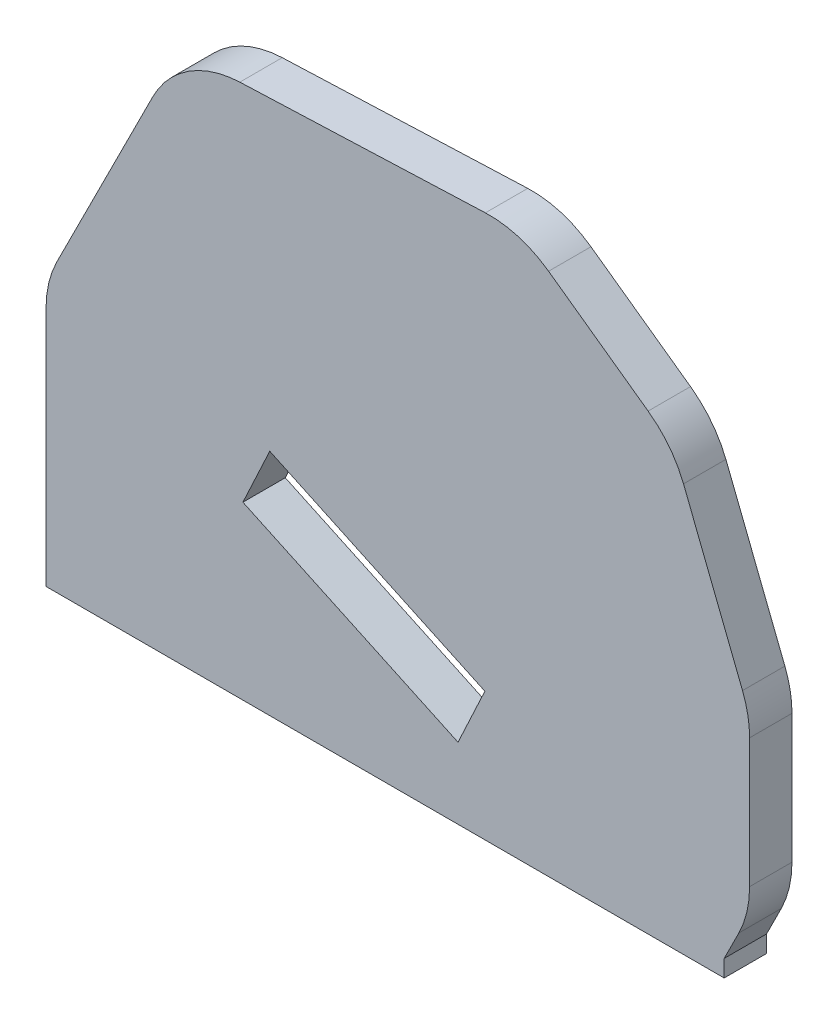
ISO-10303-21;
HEADER;
FILE_DESCRIPTION(('STEP AP214'),'2;1');
FILE_NAME('part.step','',(''),(''),'','','');
FILE_SCHEMA(('AUTOMOTIVE_DESIGN { 1 0 10303 214 1 1 1 1 }'));
ENDSEC;
DATA;
#1=APPLICATION_CONTEXT('core data for automotive mechanical design processes');
#2=APPLICATION_PROTOCOL_DEFINITION('international standard','automotive_design',2000,#1);
#3=PRODUCT_CONTEXT('',#1,'mechanical');
#4=PRODUCT('Part','Part','',(#3));
#5=PRODUCT_RELATED_PRODUCT_CATEGORY('part','',(#4));
#6=PRODUCT_DEFINITION_FORMATION('','',#4);
#7=PRODUCT_DEFINITION_CONTEXT('part definition',#1,'design');
#8=PRODUCT_DEFINITION('design','',#6,#7);
#9=PRODUCT_DEFINITION_SHAPE('','',#8);
#10=(LENGTH_UNIT() NAMED_UNIT(*) SI_UNIT(.MILLI.,.METRE.));
#11=(NAMED_UNIT(*) PLANE_ANGLE_UNIT() SI_UNIT($,.RADIAN.));
#12=(NAMED_UNIT(*) SI_UNIT($,.STERADIAN.) SOLID_ANGLE_UNIT());
#13=UNCERTAINTY_MEASURE_WITH_UNIT(LENGTH_MEASURE(1.E-05),#10,'distance_accuracy_value','');
#14=(GEOMETRIC_REPRESENTATION_CONTEXT(3) GLOBAL_UNCERTAINTY_ASSIGNED_CONTEXT((#13)) GLOBAL_UNIT_ASSIGNED_CONTEXT((#10,
#11,#12)) REPRESENTATION_CONTEXT('',''));
#15=CARTESIAN_POINT('',(0.,0.,0.));
#16=DIRECTION('',(0.,0.,1.));
#17=DIRECTION('',(1.,0.,0.));
#18=AXIS2_PLACEMENT_3D('',#15,#16,#17);
#19=CARTESIAN_POINT('',(0.,0.,0.125));
#20=DIRECTION('',(0.,0.,1.));
#21=DIRECTION('',(1.,0.,0.));
#22=AXIS2_PLACEMENT_3D('',#19,#20,#21);
#23=PLANE('',#22);
#24=DIRECTION('',(0.447213595499958,0.894427190999916,0.));
#25=VECTOR('',#24,1.);
#26=CARTESIAN_POINT('',(4.,0.1,0.125));
#27=LINE('',#26,#25);
#28=CARTESIAN_POINT('',(4.,0.1,0.125));
#29=VERTEX_POINT('',#28);
#30=CARTESIAN_POINT('',(4.08665631459995,0.273312629199899,0.125));
#31=VERTEX_POINT('',#30);
#32=EDGE_CURVE('E274',#29,#31,#27,.T.);
#33=ORIENTED_EDGE('',*,*,#32,.T.);
#34=CARTESIAN_POINT('',(3.55,0.541640786499874,0.125));
#35=DIRECTION('',(0.,0.,1.));
#36=DIRECTION('',(1.,0.,0.));
#37=AXIS2_PLACEMENT_3D('',#34,#35,#36);
#38=CIRCLE('',#37,0.6);
#39=CARTESIAN_POINT('',(4.15,0.541640786499874,0.125));
#40=VERTEX_POINT('',#39);
#41=EDGE_CURVE('E380',#31,#40,#38,.T.);
#42=ORIENTED_EDGE('',*,*,#41,.T.);
#43=DIRECTION('',(0.,1.,0.));
#44=VECTOR('',#43,1.);
#45=CARTESIAN_POINT('',(4.15,0.4,0.125));
#46=LINE('',#45,#44);
#47=CARTESIAN_POINT('',(4.15,1.30201288561444,0.125));
#48=VERTEX_POINT('',#47);
#49=EDGE_CURVE('E278',#40,#48,#46,.T.);
#50=ORIENTED_EDGE('',*,*,#49,.T.);
#51=CARTESIAN_POINT('',(3.55,1.30201288561444,0.125));
#52=DIRECTION('',(0.,0.,1.));
#53=DIRECTION('',(1.,0.,0.));
#54=AXIS2_PLACEMENT_3D('',#51,#52,#53);
#55=CIRCLE('',#54,0.6);
#56=CARTESIAN_POINT('',(4.10813037386705,1.52221843905718,0.125));
#57=VERTEX_POINT('',#56);
#58=EDGE_CURVE('E377',#48,#57,#55,.T.);
#59=ORIENTED_EDGE('',*,*,#58,.T.);
#60=DIRECTION('',(-0.367009255737904,0.930217289778421,0.));
#61=VECTOR('',#60,1.);
#62=CARTESIAN_POINT('',(4.15,1.4160961831835,0.125));
#63=LINE('',#62,#61);
#64=CARTESIAN_POINT('',(3.76013876774564,2.40423382055228,0.125));
#65=VERTEX_POINT('',#64);
#66=EDGE_CURVE('E282',#57,#65,#63,.T.);
#67=ORIENTED_EDGE('',*,*,#66,.T.);
#68=CARTESIAN_POINT('',(3.20200839387859,2.18402826710954,0.125));
#69=DIRECTION('',(0.,0.,1.));
#70=DIRECTION('',(1.,0.,0.));
#71=AXIS2_PLACEMENT_3D('',#68,#69,#70);
#72=CIRCLE('',#71,0.6);
#73=CARTESIAN_POINT('',(3.55147569512048,2.67175011956513,0.125));
#74=VERTEX_POINT('',#73);
#75=EDGE_CURVE('E374',#65,#74,#72,.T.);
#76=ORIENTED_EDGE('',*,*,#75,.T.);
#77=DIRECTION('',(-0.812869754092644,0.582445502069821,0.));
#78=VECTOR('',#77,1.);
#79=CARTESIAN_POINT('',(3.69523272369698,2.5687439069908,0.125));
#80=LINE('',#79,#78);
#81=CARTESIAN_POINT('',(2.96433257743022,3.09245573230092,0.125));
#82=VERTEX_POINT('',#81);
#83=EDGE_CURVE('E286',#74,#82,#80,.T.);
#84=ORIENTED_EDGE('',*,*,#83,.T.);
#85=CARTESIAN_POINT('',(2.61486527618833,2.60473387984534,0.125));
#86=DIRECTION('',(0.,0.,1.));
#87=DIRECTION('',(1.,0.,0.));
#88=AXIS2_PLACEMENT_3D('',#85,#86,#87);
#89=CIRCLE('',#88,0.6);
#90=CARTESIAN_POINT('',(2.59147813086542,3.20427790778127,0.125));
#91=VERTEX_POINT('',#90);
#92=EDGE_CURVE('E371',#82,#91,#89,.T.);
#93=ORIENTED_EDGE('',*,*,#92,.T.);
#94=DIRECTION('',(-0.999240046559891,-0.0389785755381909,0.));
#95=VECTOR('',#94,1.);
#96=CARTESIAN_POINT('',(2.79707885903946,3.2122980262117,0.125));
#97=LINE('',#96,#95);
#98=CARTESIAN_POINT('',(1.14319745318079,3.14778305652908,0.125));
#99=VERTEX_POINT('',#98);
#100=EDGE_CURVE('E290',#91,#99,#97,.T.);
#101=ORIENTED_EDGE('',*,*,#100,.T.);
#102=CARTESIAN_POINT('',(1.16658459850371,2.54823902859315,0.125));
#103=DIRECTION('',(0.,0.,1.));
#104=DIRECTION('',(1.,0.,0.));
#105=AXIS2_PLACEMENT_3D('',#102,#103,#104);
#106=CIRCLE('',#105,0.6);
#107=CARTESIAN_POINT('',(0.630452139512454,2.81761235024173,0.125));
#108=VERTEX_POINT('',#107);
#109=EDGE_CURVE('E72',#99,#108,#106,.T.);
#110=ORIENTED_EDGE('',*,*,#109,.T.);
#111=DIRECTION('',(-0.448955536080968,-0.893554098318759,0.));
#112=VECTOR('',#111,1.);
#113=CARTESIAN_POINT('',(0.789408464148655,3.13398237782225,0.125));
#114=LINE('',#113,#112);
#115=CARTESIAN_POINT('',(0.0638675410087443,1.68994168054322,0.125));
#116=VERTEX_POINT('',#115);
#117=EDGE_CURVE('E293',#108,#116,#114,.T.);
#118=ORIENTED_EDGE('',*,*,#117,.T.);
#119=CARTESIAN_POINT('',(0.6,1.42056835889464,0.125));
#120=DIRECTION('',(0.,0.,1.));
#121=DIRECTION('',(1.,0.,0.));
#122=AXIS2_PLACEMENT_3D('',#119,#120,#121);
#123=CIRCLE('',#122,0.6);
#124=CARTESIAN_POINT('',(0.,1.42056835889464,0.125));
#125=VERTEX_POINT('',#124);
#126=EDGE_CURVE('E366',#116,#125,#123,.T.);
#127=ORIENTED_EDGE('',*,*,#126,.T.);
#128=DIRECTION('',(0.,-1.,0.));
#129=VECTOR('',#128,1.);
#130=CARTESIAN_POINT('',(0.,1.56282641314709,0.125));
#131=LINE('',#130,#129);
#132=CARTESIAN_POINT('',(0.,0.,0.125));
#133=VERTEX_POINT('',#132);
#134=EDGE_CURVE('E264',#125,#133,#131,.T.);
#135=ORIENTED_EDGE('',*,*,#134,.T.);
#136=DIRECTION('',(1.,0.,0.));
#137=VECTOR('',#136,1.);
#138=CARTESIAN_POINT('',(0.,0.,0.125));
#139=LINE('',#138,#137);
#140=CARTESIAN_POINT('',(4.,0.,0.125));
#141=VERTEX_POINT('',#140);
#142=EDGE_CURVE('E267',#133,#141,#139,.T.);
#143=ORIENTED_EDGE('',*,*,#142,.T.);
#144=DIRECTION('',(0.,1.,0.));
#145=VECTOR('',#144,1.);
#146=CARTESIAN_POINT('',(4.,0.,0.125));
#147=LINE('',#146,#145);
#148=EDGE_CURVE('E271',#141,#29,#147,.T.);
#149=ORIENTED_EDGE('',*,*,#148,.T.);
#150=EDGE_LOOP('',(#33,#42,#50,#59,#67,#76,#84,#93,#101,#110,#118,#127,#135,#143,#149));
#151=FACE_BOUND('',#150,.T.);
#152=DIRECTION('',(0.90630778703665,-0.4226182617407,0.));
#153=VECTOR('',#152,1.);
#154=CARTESIAN_POINT('',(1.16129843717303,1.01098960271376,0.125));
#155=LINE('',#154,#153);
#156=CARTESIAN_POINT('',(1.16129843717303,1.01098960271376,0.125));
#157=VERTEX_POINT('',#156);
#158=CARTESIAN_POINT('',(2.43012933902434,0.419324036276782,0.125));
#159=VERTEX_POINT('',#158);
#160=EDGE_CURVE('E222',#157,#159,#155,.T.);
#161=ORIENTED_EDGE('',*,*,#160,.F.);
#162=DIRECTION('',(-0.4226182617407,-0.90630778703665,0.));
#163=VECTOR('',#162,1.);
#164=CARTESIAN_POINT('',(1.16129843717303,1.01098960271376,0.125));
#165=LINE('',#164,#163);
#166=CARTESIAN_POINT('',(1.31978028532579,1.3508550228525,0.125));
#167=VERTEX_POINT('',#166);
#168=EDGE_CURVE('E211',#167,#157,#165,.T.);
#169=ORIENTED_EDGE('',*,*,#168,.F.);
#170=DIRECTION('',(-0.90630778703665,0.4226182617407,0.));
#171=VECTOR('',#170,1.);
#172=CARTESIAN_POINT('',(1.31978028532579,1.3508550228525,0.125));
#173=LINE('',#172,#171);
#174=CARTESIAN_POINT('',(2.5886111871771,0.759189456415525,0.125));
#175=VERTEX_POINT('',#174);
#176=EDGE_CURVE('E240',#175,#167,#173,.T.);
#177=ORIENTED_EDGE('',*,*,#176,.F.);
#178=DIRECTION('',(0.4226182617407,0.90630778703665,0.));
#179=VECTOR('',#178,1.);
#180=CARTESIAN_POINT('',(2.43012933902434,0.419324036276782,0.125));
#181=LINE('',#180,#179);
#182=EDGE_CURVE('E236',#159,#175,#181,.T.);
#183=ORIENTED_EDGE('',*,*,#182,.F.);
#184=EDGE_LOOP('',(#161,#169,#177,#183));
#185=FACE_BOUND('',#184,.T.);
#186=ADVANCED_FACE('F45',(#151,#185),#23,.T.);
#187=CARTESIAN_POINT('',(0.,0.,-0.125));
#188=DIRECTION('',(0.,0.,1.));
#189=DIRECTION('',(1.,0.,0.));
#190=AXIS2_PLACEMENT_3D('',#187,#188,#189);
#191=PLANE('',#190);
#192=DIRECTION('',(0.,1.,0.));
#193=VECTOR('',#192,1.);
#194=CARTESIAN_POINT('',(4.15,0.4,-0.125));
#195=LINE('',#194,#193);
#196=CARTESIAN_POINT('',(4.15,0.541640786499874,-0.125));
#197=VERTEX_POINT('',#196);
#198=CARTESIAN_POINT('',(4.15,1.30201288561444,-0.125));
#199=VERTEX_POINT('',#198);
#200=EDGE_CURVE('E309',#197,#199,#195,.T.);
#201=ORIENTED_EDGE('',*,*,#200,.F.);
#202=CARTESIAN_POINT('',(3.55,0.541640786499874,-0.125));
#203=DIRECTION('',(0.,0.,1.));
#204=DIRECTION('',(1.,0.,0.));
#205=AXIS2_PLACEMENT_3D('',#202,#203,#204);
#206=CIRCLE('',#205,0.6);
#207=CARTESIAN_POINT('',(4.08665631459995,0.273312629199899,-0.125));
#208=VERTEX_POINT('',#207);
#209=EDGE_CURVE('E360',#197,#208,#206,.F.);
#210=ORIENTED_EDGE('',*,*,#209,.T.);
#211=DIRECTION('',(0.447213595499958,0.894427190999916,0.));
#212=VECTOR('',#211,1.);
#213=CARTESIAN_POINT('',(4.,0.1,-0.125));
#214=LINE('',#213,#212);
#215=CARTESIAN_POINT('',(4.,0.1,-0.125));
#216=VERTEX_POINT('',#215);
#217=EDGE_CURVE('E305',#216,#208,#214,.T.);
#218=ORIENTED_EDGE('',*,*,#217,.F.);
#219=DIRECTION('',(0.,1.,0.));
#220=VECTOR('',#219,1.);
#221=CARTESIAN_POINT('',(4.,0.,-0.125));
#222=LINE('',#221,#220);
#223=CARTESIAN_POINT('',(4.,0.,-0.125));
#224=VERTEX_POINT('',#223);
#225=EDGE_CURVE('E302',#224,#216,#222,.T.);
#226=ORIENTED_EDGE('',*,*,#225,.F.);
#227=DIRECTION('',(1.,0.,0.));
#228=VECTOR('',#227,1.);
#229=CARTESIAN_POINT('',(0.,0.,-0.125));
#230=LINE('',#229,#228);
#231=CARTESIAN_POINT('',(0.,0.,-0.125));
#232=VERTEX_POINT('',#231);
#233=EDGE_CURVE('E299',#232,#224,#230,.T.);
#234=ORIENTED_EDGE('',*,*,#233,.F.);
#235=DIRECTION('',(0.,-1.,0.));
#236=VECTOR('',#235,1.);
#237=CARTESIAN_POINT('',(0.,1.56282641314709,-0.125));
#238=LINE('',#237,#236);
#239=CARTESIAN_POINT('',(0.,1.42056835889464,-0.125));
#240=VERTEX_POINT('',#239);
#241=EDGE_CURVE('E231',#240,#232,#238,.T.);
#242=ORIENTED_EDGE('',*,*,#241,.F.);
#243=CARTESIAN_POINT('',(0.6,1.42056835889464,-0.125));
#244=DIRECTION('',(0.,0.,1.));
#245=DIRECTION('',(1.,0.,0.));
#246=AXIS2_PLACEMENT_3D('',#243,#244,#245);
#247=CIRCLE('',#246,0.6);
#248=CARTESIAN_POINT('',(0.0638675410087443,1.68994168054322,-0.125));
#249=VERTEX_POINT('',#248);
#250=EDGE_CURVE('E345',#240,#249,#247,.F.);
#251=ORIENTED_EDGE('',*,*,#250,.T.);
#252=DIRECTION('',(-0.448955536080968,-0.893554098318759,0.));
#253=VECTOR('',#252,1.);
#254=CARTESIAN_POINT('',(0.789408464148655,3.13398237782225,-0.125));
#255=LINE('',#254,#253);
#256=CARTESIAN_POINT('',(0.630452139512454,2.81761235024173,-0.125));
#257=VERTEX_POINT('',#256);
#258=EDGE_CURVE('E268',#257,#249,#255,.T.);
#259=ORIENTED_EDGE('',*,*,#258,.F.);
#260=CARTESIAN_POINT('',(1.16658459850371,2.54823902859315,-0.125));
#261=DIRECTION('',(0.,0.,1.));
#262=DIRECTION('',(1.,0.,0.));
#263=AXIS2_PLACEMENT_3D('',#260,#261,#262);
#264=CIRCLE('',#263,0.6);
#265=CARTESIAN_POINT('',(1.14319745318079,3.14778305652908,-0.125));
#266=VERTEX_POINT('',#265);
#267=EDGE_CURVE('E348',#257,#266,#264,.F.);
#268=ORIENTED_EDGE('',*,*,#267,.T.);
#269=DIRECTION('',(-0.999240046559891,-0.0389785755381909,0.));
#270=VECTOR('',#269,1.);
#271=CARTESIAN_POINT('',(2.79707885903946,3.2122980262117,-0.125));
#272=LINE('',#271,#270);
#273=CARTESIAN_POINT('',(2.59147813086542,3.20427790778127,-0.125));
#274=VERTEX_POINT('',#273);
#275=EDGE_CURVE('E321',#274,#266,#272,.T.);
#276=ORIENTED_EDGE('',*,*,#275,.F.);
#277=CARTESIAN_POINT('',(2.61486527618833,2.60473387984534,-0.125));
#278=DIRECTION('',(0.,0.,1.));
#279=DIRECTION('',(1.,0.,0.));
#280=AXIS2_PLACEMENT_3D('',#277,#278,#279);
#281=CIRCLE('',#280,0.6);
#282=CARTESIAN_POINT('',(2.96433257743022,3.09245573230092,-0.125));
#283=VERTEX_POINT('',#282);
#284=EDGE_CURVE('E351',#274,#283,#281,.F.);
#285=ORIENTED_EDGE('',*,*,#284,.T.);
#286=DIRECTION('',(-0.812869754092644,0.582445502069821,0.));
#287=VECTOR('',#286,1.);
#288=CARTESIAN_POINT('',(3.69523272369698,2.5687439069908,-0.125));
#289=LINE('',#288,#287);
#290=CARTESIAN_POINT('',(3.55147569512048,2.67175011956513,-0.125));
#291=VERTEX_POINT('',#290);
#292=EDGE_CURVE('E317',#291,#283,#289,.T.);
#293=ORIENTED_EDGE('',*,*,#292,.F.);
#294=CARTESIAN_POINT('',(3.20200839387859,2.18402826710954,-0.125));
#295=DIRECTION('',(0.,0.,1.));
#296=DIRECTION('',(1.,0.,0.));
#297=AXIS2_PLACEMENT_3D('',#294,#295,#296);
#298=CIRCLE('',#297,0.6);
#299=CARTESIAN_POINT('',(3.76013876774564,2.40423382055228,-0.125));
#300=VERTEX_POINT('',#299);
#301=EDGE_CURVE('E354',#291,#300,#298,.F.);
#302=ORIENTED_EDGE('',*,*,#301,.T.);
#303=DIRECTION('',(-0.367009255737904,0.930217289778421,0.));
#304=VECTOR('',#303,1.);
#305=CARTESIAN_POINT('',(4.15,1.4160961831835,-0.125));
#306=LINE('',#305,#304);
#307=CARTESIAN_POINT('',(4.10813037386705,1.52221843905718,-0.125));
#308=VERTEX_POINT('',#307);
#309=EDGE_CURVE('E313',#308,#300,#306,.T.);
#310=ORIENTED_EDGE('',*,*,#309,.F.);
#311=CARTESIAN_POINT('',(3.55,1.30201288561444,-0.125));
#312=DIRECTION('',(0.,0.,1.));
#313=DIRECTION('',(1.,0.,0.));
#314=AXIS2_PLACEMENT_3D('',#311,#312,#313);
#315=CIRCLE('',#314,0.6);
#316=EDGE_CURVE('E357',#308,#199,#315,.F.);
#317=ORIENTED_EDGE('',*,*,#316,.T.);
#318=EDGE_LOOP('',(#201,#210,#218,#226,#234,#242,#251,#259,#268,#276,#285,#293,#302,#310,#317));
#319=FACE_BOUND('',#318,.T.);
#320=DIRECTION('',(-0.4226182617407,-0.90630778703665,0.));
#321=VECTOR('',#320,1.);
#322=CARTESIAN_POINT('',(1.16129843717303,1.01098960271376,-0.125));
#323=LINE('',#322,#321);
#324=CARTESIAN_POINT('',(1.31978028532579,1.3508550228525,-0.125));
#325=VERTEX_POINT('',#324);
#326=CARTESIAN_POINT('',(1.16129843717303,1.01098960271376,-0.125));
#327=VERTEX_POINT('',#326);
#328=EDGE_CURVE('E245',#325,#327,#323,.T.);
#329=ORIENTED_EDGE('',*,*,#328,.T.);
#330=DIRECTION('',(0.90630778703665,-0.4226182617407,0.));
#331=VECTOR('',#330,1.);
#332=CARTESIAN_POINT('',(1.16129843717303,1.01098960271376,-0.125));
#333=LINE('',#332,#331);
#334=CARTESIAN_POINT('',(2.43012933902434,0.419324036276782,-0.125));
#335=VERTEX_POINT('',#334);
#336=EDGE_CURVE('E229',#327,#335,#333,.T.);
#337=ORIENTED_EDGE('',*,*,#336,.T.);
#338=DIRECTION('',(0.4226182617407,0.90630778703665,0.));
#339=VECTOR('',#338,1.);
#340=CARTESIAN_POINT('',(2.43012933902434,0.419324036276782,-0.125));
#341=LINE('',#340,#339);
#342=CARTESIAN_POINT('',(2.5886111871771,0.759189456415525,-0.125));
#343=VERTEX_POINT('',#342);
#344=EDGE_CURVE('E250',#335,#343,#341,.T.);
#345=ORIENTED_EDGE('',*,*,#344,.T.);
#346=DIRECTION('',(-0.90630778703665,0.4226182617407,0.));
#347=VECTOR('',#346,1.);
#348=CARTESIAN_POINT('',(1.31978028532579,1.3508550228525,-0.125));
#349=LINE('',#348,#347);
#350=EDGE_CURVE('E223',#343,#325,#349,.T.);
#351=ORIENTED_EDGE('',*,*,#350,.T.);
#352=EDGE_LOOP('',(#329,#337,#345,#351));
#353=FACE_BOUND('',#352,.T.);
#354=ADVANCED_FACE('F413',(#319,#353),#191,.F.);
#355=CARTESIAN_POINT('',(0.,1.56282641314709,0.125));
#356=DIRECTION('',(1.,0.,0.));
#357=DIRECTION('',(0.,1.,0.));
#358=AXIS2_PLACEMENT_3D('',#355,#356,#357);
#359=PLANE('',#358);
#360=ORIENTED_EDGE('',*,*,#134,.F.);
#361=DIRECTION('',(0.,0.,-1.));
#362=VECTOR('',#361,1.);
#363=CARTESIAN_POINT('',(0.,1.42056835889464,0.125));
#364=LINE('',#363,#362);
#365=EDGE_CURVE('E11',#125,#240,#364,.T.);
#366=ORIENTED_EDGE('',*,*,#365,.T.);
#367=ORIENTED_EDGE('',*,*,#241,.T.);
#368=DIRECTION('',(0.,0.,-1.));
#369=VECTOR('',#368,1.);
#370=CARTESIAN_POINT('',(0.,0.,0.125));
#371=LINE('',#370,#369);
#372=EDGE_CURVE('E334',#133,#232,#371,.T.);
#373=ORIENTED_EDGE('',*,*,#372,.F.);
#374=EDGE_LOOP('',(#360,#366,#367,#373));
#375=FACE_BOUND('',#374,.T.);
#376=ADVANCED_FACE('F423',(#375),#359,.F.);
#377=CARTESIAN_POINT('',(0.,0.,0.125));
#378=DIRECTION('',(0.,1.,0.));
#379=DIRECTION('',(0.,0.,1.));
#380=AXIS2_PLACEMENT_3D('',#377,#378,#379);
#381=PLANE('',#380);
#382=ORIENTED_EDGE('',*,*,#233,.T.);
#383=DIRECTION('',(0.,0.,-1.));
#384=VECTOR('',#383,1.);
#385=CARTESIAN_POINT('',(4.,0.,0.125));
#386=LINE('',#385,#384);
#387=EDGE_CURVE('E330',#141,#224,#386,.T.);
#388=ORIENTED_EDGE('',*,*,#387,.F.);
#389=ORIENTED_EDGE('',*,*,#142,.F.);
#390=ORIENTED_EDGE('',*,*,#372,.T.);
#391=EDGE_LOOP('',(#382,#388,#389,#390));
#392=FACE_BOUND('',#391,.T.);
#393=ADVANCED_FACE('F428',(#392),#381,.F.);
#394=CARTESIAN_POINT('',(4.,0.,0.125));
#395=DIRECTION('',(-1.,0.,0.));
#396=DIRECTION('',(0.,0.,1.));
#397=AXIS2_PLACEMENT_3D('',#394,#395,#396);
#398=PLANE('',#397);
#399=ORIENTED_EDGE('',*,*,#225,.T.);
#400=DIRECTION('',(0.,0.,-1.));
#401=VECTOR('',#400,1.);
#402=CARTESIAN_POINT('',(4.,0.1,0.125));
#403=LINE('',#402,#401);
#404=EDGE_CURVE('E296',#29,#216,#403,.T.);
#405=ORIENTED_EDGE('',*,*,#404,.F.);
#406=ORIENTED_EDGE('',*,*,#148,.F.);
#407=ORIENTED_EDGE('',*,*,#387,.T.);
#408=EDGE_LOOP('',(#399,#405,#406,#407));
#409=FACE_BOUND('',#408,.T.);
#410=ADVANCED_FACE('F433',(#409),#398,.F.);
#411=CARTESIAN_POINT('',(4.,0.1,0.125));
#412=DIRECTION('',(-0.894427190999916,0.447213595499958,0.));
#413=DIRECTION('',(-0.447213595499958,-0.894427190999916,0.));
#414=AXIS2_PLACEMENT_3D('',#411,#412,#413);
#415=PLANE('',#414);
#416=ORIENTED_EDGE('',*,*,#217,.T.);
#417=DIRECTION('',(0.,0.,-1.));
#418=VECTOR('',#417,1.);
#419=CARTESIAN_POINT('',(4.08665631459995,0.273312629199899,0.125));
#420=LINE('',#419,#418);
#421=EDGE_CURVE('E363',#208,#31,#420,.F.);
#422=ORIENTED_EDGE('',*,*,#421,.T.);
#423=ORIENTED_EDGE('',*,*,#32,.F.);
#424=ORIENTED_EDGE('',*,*,#404,.T.);
#425=EDGE_LOOP('',(#416,#422,#423,#424));
#426=FACE_BOUND('',#425,.T.);
#427=ADVANCED_FACE('F498',(#426),#415,.F.);
#428=CARTESIAN_POINT('',(4.15,0.4,0.125));
#429=DIRECTION('',(-1.,0.,0.));
#430=DIRECTION('',(0.,0.,1.));
#431=AXIS2_PLACEMENT_3D('',#428,#429,#430);
#432=PLANE('',#431);
#433=ORIENTED_EDGE('',*,*,#49,.F.);
#434=DIRECTION('',(0.,0.,-1.));
#435=VECTOR('',#434,1.);
#436=CARTESIAN_POINT('',(4.15,0.541640786499874,0.125));
#437=LINE('',#436,#435);
#438=EDGE_CURVE('E341',#40,#197,#437,.T.);
#439=ORIENTED_EDGE('',*,*,#438,.T.);
#440=ORIENTED_EDGE('',*,*,#200,.T.);
#441=DIRECTION('',(0.,0.,-1.));
#442=VECTOR('',#441,1.);
#443=CARTESIAN_POINT('',(4.15,1.30201288561444,0.125));
#444=LINE('',#443,#442);
#445=EDGE_CURVE('E338',#199,#48,#444,.F.);
#446=ORIENTED_EDGE('',*,*,#445,.T.);
#447=EDGE_LOOP('',(#433,#439,#440,#446));
#448=FACE_BOUND('',#447,.T.);
#449=ADVANCED_FACE('F443',(#448),#432,.F.);
#450=CARTESIAN_POINT('',(4.15,1.4160961831835,0.125));
#451=DIRECTION('',(-0.930217289778421,-0.367009255737904,0.));
#452=DIRECTION('',(0.367009255737904,-0.930217289778421,0.));
#453=AXIS2_PLACEMENT_3D('',#450,#451,#452);
#454=PLANE('',#453);
#455=ORIENTED_EDGE('',*,*,#66,.F.);
#456=DIRECTION('',(0.,0.,-1.));
#457=VECTOR('',#456,1.);
#458=CARTESIAN_POINT('',(4.10813037386705,1.52221843905718,0.125));
#459=LINE('',#458,#457);
#460=EDGE_CURVE('E386',#57,#308,#459,.T.);
#461=ORIENTED_EDGE('',*,*,#460,.T.);
#462=ORIENTED_EDGE('',*,*,#309,.T.);
#463=DIRECTION('',(0.,0.,-1.));
#464=VECTOR('',#463,1.);
#465=CARTESIAN_POINT('',(3.76013876774564,2.40423382055228,0.125));
#466=LINE('',#465,#464);
#467=EDGE_CURVE('E383',#300,#65,#466,.F.);
#468=ORIENTED_EDGE('',*,*,#467,.T.);
#469=EDGE_LOOP('',(#455,#461,#462,#468));
#470=FACE_BOUND('',#469,.T.);
#471=ADVANCED_FACE('F453',(#470),#454,.F.);
#472=CARTESIAN_POINT('',(3.69523272369698,2.5687439069908,0.125));
#473=DIRECTION('',(-0.582445502069821,-0.812869754092643,0.));
#474=DIRECTION('',(0.812869754092644,-0.582445502069821,0.));
#475=AXIS2_PLACEMENT_3D('',#472,#473,#474);
#476=PLANE('',#475);
#477=ORIENTED_EDGE('',*,*,#83,.F.);
#478=DIRECTION('',(0.,0.,-1.));
#479=VECTOR('',#478,1.);
#480=CARTESIAN_POINT('',(3.55147569512048,2.67175011956513,0.125));
#481=LINE('',#480,#479);
#482=EDGE_CURVE('E393',#74,#291,#481,.T.);
#483=ORIENTED_EDGE('',*,*,#482,.T.);
#484=ORIENTED_EDGE('',*,*,#292,.T.);
#485=DIRECTION('',(0.,0.,-1.));
#486=VECTOR('',#485,1.);
#487=CARTESIAN_POINT('',(2.96433257743022,3.09245573230092,0.125));
#488=LINE('',#487,#486);
#489=EDGE_CURVE('E390',#283,#82,#488,.F.);
#490=ORIENTED_EDGE('',*,*,#489,.T.);
#491=EDGE_LOOP('',(#477,#483,#484,#490));
#492=FACE_BOUND('',#491,.T.);
#493=ADVANCED_FACE('F462',(#492),#476,.F.);
#494=CARTESIAN_POINT('',(2.79707885903946,3.2122980262117,0.125));
#495=DIRECTION('',(0.0389785755381909,-0.999240046559891,0.));
#496=DIRECTION('',(0.999240046559891,0.0389785755381909,0.));
#497=AXIS2_PLACEMENT_3D('',#494,#495,#496);
#498=PLANE('',#497);
#499=ORIENTED_EDGE('',*,*,#100,.F.);
#500=DIRECTION('',(0.,0.,-1.));
#501=VECTOR('',#500,1.);
#502=CARTESIAN_POINT('',(2.59147813086542,3.20427790778127,0.125));
#503=LINE('',#502,#501);
#504=EDGE_CURVE('E400',#91,#274,#503,.T.);
#505=ORIENTED_EDGE('',*,*,#504,.T.);
#506=ORIENTED_EDGE('',*,*,#275,.T.);
#507=DIRECTION('',(0.,0.,-1.));
#508=VECTOR('',#507,1.);
#509=CARTESIAN_POINT('',(1.14319745318079,3.14778305652908,0.125));
#510=LINE('',#509,#508);
#511=EDGE_CURVE('E397',#266,#99,#510,.F.);
#512=ORIENTED_EDGE('',*,*,#511,.T.);
#513=EDGE_LOOP('',(#499,#505,#506,#512));
#514=FACE_BOUND('',#513,.T.);
#515=ADVANCED_FACE('F470',(#514),#498,.F.);
#516=CARTESIAN_POINT('',(0.789408464148655,3.13398237782225,0.125));
#517=DIRECTION('',(0.893554098318759,-0.448955536080968,0.));
#518=DIRECTION('',(0.448955536080968,0.893554098318759,0.));
#519=AXIS2_PLACEMENT_3D('',#516,#517,#518);
#520=PLANE('',#519);
#521=ORIENTED_EDGE('',*,*,#117,.F.);
#522=DIRECTION('',(0.,0.,-1.));
#523=VECTOR('',#522,1.);
#524=CARTESIAN_POINT('',(0.630452139512454,2.81761235024173,0.125));
#525=LINE('',#524,#523);
#526=EDGE_CURVE('E54',#108,#257,#525,.T.);
#527=ORIENTED_EDGE('',*,*,#526,.T.);
#528=ORIENTED_EDGE('',*,*,#258,.T.);
#529=DIRECTION('',(0.,0.,-1.));
#530=VECTOR('',#529,1.);
#531=CARTESIAN_POINT('',(0.0638675410087443,1.68994168054322,0.125));
#532=LINE('',#531,#530);
#533=EDGE_CURVE('E64',#249,#116,#532,.F.);
#534=ORIENTED_EDGE('',*,*,#533,.T.);
#535=EDGE_LOOP('',(#521,#527,#528,#534));
#536=FACE_BOUND('',#535,.T.);
#537=ADVANCED_FACE('F409',(#536),#520,.F.);
#538=CARTESIAN_POINT('',(1.16129843717303,1.01098960271376,0.125));
#539=DIRECTION('',(0.90630778703665,-0.4226182617407,0.));
#540=DIRECTION('',(0.4226182617407,0.90630778703665,0.));
#541=AXIS2_PLACEMENT_3D('',#538,#539,#540);
#542=PLANE('',#541);
#543=ORIENTED_EDGE('',*,*,#328,.F.);
#544=DIRECTION('',(0.,0.,-1.));
#545=VECTOR('',#544,1.);
#546=CARTESIAN_POINT('',(1.31978028532579,1.3508550228525,0.125));
#547=LINE('',#546,#545);
#548=EDGE_CURVE('E217',#167,#325,#547,.T.);
#549=ORIENTED_EDGE('',*,*,#548,.F.);
#550=ORIENTED_EDGE('',*,*,#168,.T.);
#551=DIRECTION('',(0.,0.,-1.));
#552=VECTOR('',#551,1.);
#553=CARTESIAN_POINT('',(1.16129843717303,1.01098960271376,0.125));
#554=LINE('',#553,#552);
#555=EDGE_CURVE('E214',#157,#327,#554,.T.);
#556=ORIENTED_EDGE('',*,*,#555,.T.);
#557=EDGE_LOOP('',(#543,#549,#550,#556));
#558=FACE_BOUND('',#557,.T.);
#559=ADVANCED_FACE('F213',(#558),#542,.T.);
#560=CARTESIAN_POINT('',(1.16129843717303,1.01098960271376,0.125));
#561=DIRECTION('',(0.4226182617407,0.90630778703665,0.));
#562=DIRECTION('',(-0.90630778703665,0.4226182617407,0.));
#563=AXIS2_PLACEMENT_3D('',#560,#561,#562);
#564=PLANE('',#563);
#565=ORIENTED_EDGE('',*,*,#336,.F.);
#566=ORIENTED_EDGE('',*,*,#555,.F.);
#567=ORIENTED_EDGE('',*,*,#160,.T.);
#568=DIRECTION('',(0.,0.,-1.));
#569=VECTOR('',#568,1.);
#570=CARTESIAN_POINT('',(2.43012933902434,0.419324036276782,0.125));
#571=LINE('',#570,#569);
#572=EDGE_CURVE('E232',#159,#335,#571,.T.);
#573=ORIENTED_EDGE('',*,*,#572,.T.);
#574=EDGE_LOOP('',(#565,#566,#567,#573));
#575=FACE_BOUND('',#574,.T.);
#576=ADVANCED_FACE('F226',(#575),#564,.T.);
#577=CARTESIAN_POINT('',(2.43012933902434,0.419324036276782,0.125));
#578=DIRECTION('',(-0.90630778703665,0.4226182617407,0.));
#579=DIRECTION('',(-0.4226182617407,-0.90630778703665,0.));
#580=AXIS2_PLACEMENT_3D('',#577,#578,#579);
#581=PLANE('',#580);
#582=ORIENTED_EDGE('',*,*,#344,.F.);
#583=ORIENTED_EDGE('',*,*,#572,.F.);
#584=ORIENTED_EDGE('',*,*,#182,.T.);
#585=DIRECTION('',(0.,0.,-1.));
#586=VECTOR('',#585,1.);
#587=CARTESIAN_POINT('',(2.5886111871771,0.759189456415525,0.125));
#588=LINE('',#587,#586);
#589=EDGE_CURVE('E259',#175,#343,#588,.T.);
#590=ORIENTED_EDGE('',*,*,#589,.T.);
#591=EDGE_LOOP('',(#582,#583,#584,#590));
#592=FACE_BOUND('',#591,.T.);
#593=ADVANCED_FACE('F553',(#592),#581,.T.);
#594=CARTESIAN_POINT('',(1.31978028532579,1.3508550228525,0.125));
#595=DIRECTION('',(-0.4226182617407,-0.90630778703665,0.));
#596=DIRECTION('',(0.90630778703665,-0.4226182617407,0.));
#597=AXIS2_PLACEMENT_3D('',#594,#595,#596);
#598=PLANE('',#597);
#599=ORIENTED_EDGE('',*,*,#350,.F.);
#600=ORIENTED_EDGE('',*,*,#589,.F.);
#601=ORIENTED_EDGE('',*,*,#176,.T.);
#602=ORIENTED_EDGE('',*,*,#548,.T.);
#603=EDGE_LOOP('',(#599,#600,#601,#602));
#604=FACE_BOUND('',#603,.T.);
#605=ADVANCED_FACE('F509',(#604),#598,.T.);
#606=CARTESIAN_POINT('',(3.55,0.541640786499874,0.125));
#607=DIRECTION('',(0.,0.,-1.));
#608=DIRECTION('',(-1.,0.,0.));
#609=AXIS2_PLACEMENT_3D('',#606,#607,#608);
#610=CYLINDRICAL_SURFACE('',#609,0.6);
#611=ORIENTED_EDGE('',*,*,#41,.F.);
#612=ORIENTED_EDGE('',*,*,#421,.F.);
#613=ORIENTED_EDGE('',*,*,#209,.F.);
#614=ORIENTED_EDGE('',*,*,#438,.F.);
#615=EDGE_LOOP('',(#611,#612,#613,#614));
#616=FACE_BOUND('',#615,.T.);
#617=ADVANCED_FACE('F441',(#616),#610,.T.);
#618=CARTESIAN_POINT('',(3.55,1.30201288561444,0.125));
#619=DIRECTION('',(0.,0.,-1.));
#620=DIRECTION('',(-1.,0.,0.));
#621=AXIS2_PLACEMENT_3D('',#618,#619,#620);
#622=CYLINDRICAL_SURFACE('',#621,0.6);
#623=ORIENTED_EDGE('',*,*,#58,.F.);
#624=ORIENTED_EDGE('',*,*,#445,.F.);
#625=ORIENTED_EDGE('',*,*,#316,.F.);
#626=ORIENTED_EDGE('',*,*,#460,.F.);
#627=EDGE_LOOP('',(#623,#624,#625,#626));
#628=FACE_BOUND('',#627,.T.);
#629=ADVANCED_FACE('F450',(#628),#622,.T.);
#630=CARTESIAN_POINT('',(3.20200839387859,2.18402826710954,0.125));
#631=DIRECTION('',(0.,0.,-1.));
#632=DIRECTION('',(-1.,0.,0.));
#633=AXIS2_PLACEMENT_3D('',#630,#631,#632);
#634=CYLINDRICAL_SURFACE('',#633,0.6);
#635=ORIENTED_EDGE('',*,*,#75,.F.);
#636=ORIENTED_EDGE('',*,*,#467,.F.);
#637=ORIENTED_EDGE('',*,*,#301,.F.);
#638=ORIENTED_EDGE('',*,*,#482,.F.);
#639=EDGE_LOOP('',(#635,#636,#637,#638));
#640=FACE_BOUND('',#639,.T.);
#641=ADVANCED_FACE('F459',(#640),#634,.T.);
#642=CARTESIAN_POINT('',(2.61486527618833,2.60473387984534,0.125));
#643=DIRECTION('',(0.,0.,-1.));
#644=DIRECTION('',(-1.,0.,0.));
#645=AXIS2_PLACEMENT_3D('',#642,#643,#644);
#646=CYLINDRICAL_SURFACE('',#645,0.6);
#647=ORIENTED_EDGE('',*,*,#92,.F.);
#648=ORIENTED_EDGE('',*,*,#489,.F.);
#649=ORIENTED_EDGE('',*,*,#284,.F.);
#650=ORIENTED_EDGE('',*,*,#504,.F.);
#651=EDGE_LOOP('',(#647,#648,#649,#650));
#652=FACE_BOUND('',#651,.T.);
#653=ADVANCED_FACE('F467',(#652),#646,.T.);
#654=CARTESIAN_POINT('',(1.16658459850371,2.54823902859315,0.125));
#655=DIRECTION('',(0.,0.,-1.));
#656=DIRECTION('',(-1.,0.,0.));
#657=AXIS2_PLACEMENT_3D('',#654,#655,#656);
#658=CYLINDRICAL_SURFACE('',#657,0.6);
#659=ORIENTED_EDGE('',*,*,#109,.F.);
#660=ORIENTED_EDGE('',*,*,#511,.F.);
#661=ORIENTED_EDGE('',*,*,#267,.F.);
#662=ORIENTED_EDGE('',*,*,#526,.F.);
#663=EDGE_LOOP('',(#659,#660,#661,#662));
#664=FACE_BOUND('',#663,.T.);
#665=ADVANCED_FACE('F472',(#664),#658,.T.);
#666=CARTESIAN_POINT('',(0.6,1.42056835889464,0.125));
#667=DIRECTION('',(0.,0.,-1.));
#668=DIRECTION('',(-1.,0.,0.));
#669=AXIS2_PLACEMENT_3D('',#666,#667,#668);
#670=CYLINDRICAL_SURFACE('',#669,0.6);
#671=ORIENTED_EDGE('',*,*,#126,.F.);
#672=ORIENTED_EDGE('',*,*,#533,.F.);
#673=ORIENTED_EDGE('',*,*,#250,.F.);
#674=ORIENTED_EDGE('',*,*,#365,.F.);
#675=EDGE_LOOP('',(#671,#672,#673,#674));
#676=FACE_BOUND('',#675,.T.);
#677=ADVANCED_FACE('F47',(#676),#670,.T.);
#678=CLOSED_SHELL('',(#186,#354,#376,#393,#410,#427,#449,#471,#493,#515,#537,#559,#576,#593,
#605,#617,#629,#641,#653,#665,#677));
#679=MANIFOLD_SOLID_BREP('B2',#678);
#680=ADVANCED_BREP_SHAPE_REPRESENTATION('',(#18,#679),#14);
#681=SHAPE_DEFINITION_REPRESENTATION(#9,#680);
ENDSEC;
END-ISO-10303-21;
